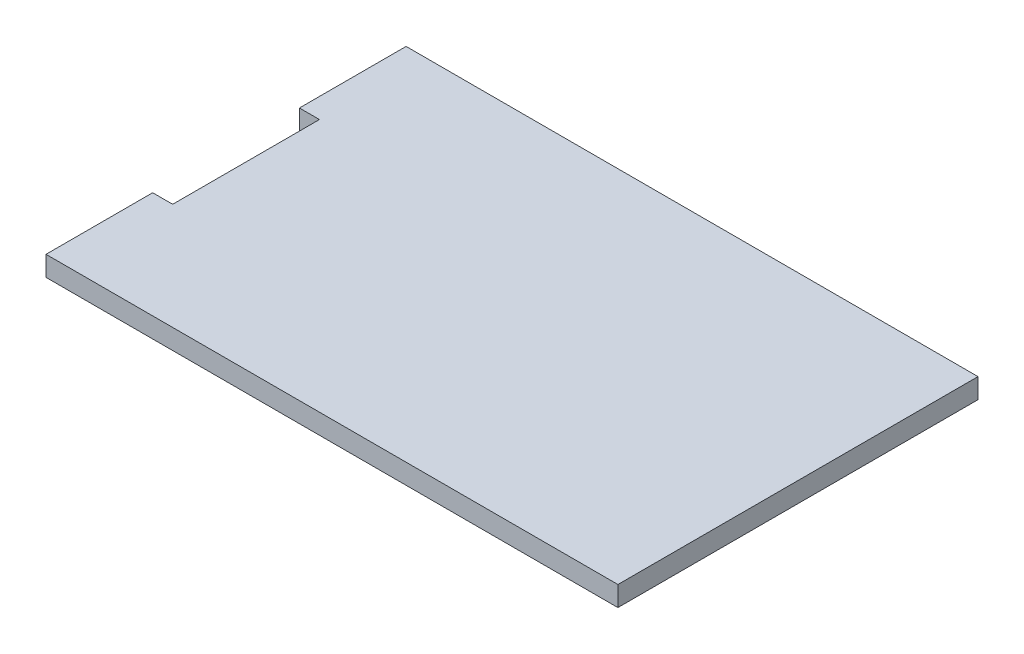
ISO-10303-21;
HEADER;
FILE_DESCRIPTION(('STEP AP214'),'2;1');
FILE_NAME('part.step','',(''),(''),'','','');
FILE_SCHEMA(('AUTOMOTIVE_DESIGN { 1 0 10303 214 1 1 1 1 }'));
ENDSEC;
DATA;
#1=APPLICATION_CONTEXT('core data for automotive mechanical design processes');
#2=APPLICATION_PROTOCOL_DEFINITION('international standard','automotive_design',2000,#1);
#3=PRODUCT_CONTEXT('',#1,'mechanical');
#4=PRODUCT('Part','Part','',(#3));
#5=PRODUCT_RELATED_PRODUCT_CATEGORY('part','',(#4));
#6=PRODUCT_DEFINITION_FORMATION('','',#4);
#7=PRODUCT_DEFINITION_CONTEXT('part definition',#1,'design');
#8=PRODUCT_DEFINITION('design','',#6,#7);
#9=PRODUCT_DEFINITION_SHAPE('','',#8);
#10=(LENGTH_UNIT() NAMED_UNIT(*) SI_UNIT(.MILLI.,.METRE.));
#11=(NAMED_UNIT(*) PLANE_ANGLE_UNIT() SI_UNIT($,.RADIAN.));
#12=(NAMED_UNIT(*) SI_UNIT($,.STERADIAN.) SOLID_ANGLE_UNIT());
#13=UNCERTAINTY_MEASURE_WITH_UNIT(LENGTH_MEASURE(1.E-05),#10,'distance_accuracy_value','');
#14=(GEOMETRIC_REPRESENTATION_CONTEXT(3) GLOBAL_UNCERTAINTY_ASSIGNED_CONTEXT((#13)) GLOBAL_UNIT_ASSIGNED_CONTEXT((#10,
#11,#12)) REPRESENTATION_CONTEXT('',''));
#15=CARTESIAN_POINT('',(0.,0.,0.));
#16=DIRECTION('',(0.,0.,1.));
#17=DIRECTION('',(1.,0.,0.));
#18=AXIS2_PLACEMENT_3D('',#15,#16,#17);
#19=CARTESIAN_POINT('',(42.8625,3.,26.9875));
#20=DIRECTION('',(-1.,0.,0.));
#21=DIRECTION('',(0.,0.,1.));
#22=AXIS2_PLACEMENT_3D('',#19,#20,#21);
#23=PLANE('',#22);
#24=DIRECTION('',(0.,0.,-1.));
#25=VECTOR('',#24,1.);
#26=CARTESIAN_POINT('',(42.8625,0.,26.9875));
#27=LINE('',#26,#25);
#28=CARTESIAN_POINT('',(42.8625,0.,26.9875));
#29=VERTEX_POINT('',#28);
#30=CARTESIAN_POINT('',(42.8625,0.,-26.9875));
#31=VERTEX_POINT('',#30);
#32=EDGE_CURVE('E128',#29,#31,#27,.T.);
#33=ORIENTED_EDGE('',*,*,#32,.T.);
#34=DIRECTION('',(0.,-1.,0.));
#35=VECTOR('',#34,1.);
#36=CARTESIAN_POINT('',(42.8625,3.,-26.9875));
#37=LINE('',#36,#35);
#38=CARTESIAN_POINT('',(42.8625,3.,-26.9875));
#39=VERTEX_POINT('',#38);
#40=EDGE_CURVE('E11',#39,#31,#37,.T.);
#41=ORIENTED_EDGE('',*,*,#40,.F.);
#42=DIRECTION('',(0.,0.,-1.));
#43=VECTOR('',#42,1.);
#44=CARTESIAN_POINT('',(42.8625,3.,26.9875));
#45=LINE('',#44,#43);
#46=CARTESIAN_POINT('',(42.8625,3.,26.9875));
#47=VERTEX_POINT('',#46);
#48=EDGE_CURVE('E142',#47,#39,#45,.T.);
#49=ORIENTED_EDGE('',*,*,#48,.F.);
#50=DIRECTION('',(0.,-1.,0.));
#51=VECTOR('',#50,1.);
#52=CARTESIAN_POINT('',(42.8625,3.,26.9875));
#53=LINE('',#52,#51);
#54=EDGE_CURVE('E124',#47,#29,#53,.T.);
#55=ORIENTED_EDGE('',*,*,#54,.T.);
#56=EDGE_LOOP('',(#33,#41,#49,#55));
#57=FACE_BOUND('',#56,.T.);
#58=ADVANCED_FACE('F32',(#57),#23,.F.);
#59=CARTESIAN_POINT('',(-42.8625,3.,-26.9875));
#60=DIRECTION('',(0.,0.,1.));
#61=DIRECTION('',(1.,0.,0.));
#62=AXIS2_PLACEMENT_3D('',#59,#60,#61);
#63=PLANE('',#62);
#64=DIRECTION('',(-1.,0.,0.));
#65=VECTOR('',#64,1.);
#66=CARTESIAN_POINT('',(-42.8625,0.,-26.9875));
#67=LINE('',#66,#65);
#68=CARTESIAN_POINT('',(-42.8625,0.,-26.9875));
#69=VERTEX_POINT('',#68);
#70=EDGE_CURVE('E131',#31,#69,#67,.T.);
#71=ORIENTED_EDGE('',*,*,#70,.T.);
#72=DIRECTION('',(0.,-1.,0.));
#73=VECTOR('',#72,1.);
#74=CARTESIAN_POINT('',(-42.8625,3.,-26.9875));
#75=LINE('',#74,#73);
#76=CARTESIAN_POINT('',(-42.8625,3.,-26.9875));
#77=VERTEX_POINT('',#76);
#78=EDGE_CURVE('E40',#77,#69,#75,.T.);
#79=ORIENTED_EDGE('',*,*,#78,.F.);
#80=DIRECTION('',(-1.,0.,0.));
#81=VECTOR('',#80,1.);
#82=CARTESIAN_POINT('',(-42.8625,3.,-26.9875));
#83=LINE('',#82,#81);
#84=EDGE_CURVE('E91',#39,#77,#83,.T.);
#85=ORIENTED_EDGE('',*,*,#84,.F.);
#86=ORIENTED_EDGE('',*,*,#40,.T.);
#87=EDGE_LOOP('',(#71,#79,#85,#86));
#88=FACE_BOUND('',#87,.T.);
#89=ADVANCED_FACE('F177',(#88),#63,.F.);
#90=CARTESIAN_POINT('',(-42.8625,3.,-11.));
#91=DIRECTION('',(1.,0.,0.));
#92=DIRECTION('',(0.,0.,-1.));
#93=AXIS2_PLACEMENT_3D('',#90,#91,#92);
#94=PLANE('',#93);
#95=DIRECTION('',(0.,0.,1.));
#96=VECTOR('',#95,1.);
#97=CARTESIAN_POINT('',(-42.8625,0.,-11.));
#98=LINE('',#97,#96);
#99=CARTESIAN_POINT('',(-42.8625,0.,-11.));
#100=VERTEX_POINT('',#99);
#101=EDGE_CURVE('E133',#69,#100,#98,.T.);
#102=ORIENTED_EDGE('',*,*,#101,.T.);
#103=DIRECTION('',(0.,-1.,0.));
#104=VECTOR('',#103,1.);
#105=CARTESIAN_POINT('',(-42.8625,3.,-11.));
#106=LINE('',#105,#104);
#107=CARTESIAN_POINT('',(-42.8625,3.,-11.));
#108=VERTEX_POINT('',#107);
#109=EDGE_CURVE('E149',#108,#100,#106,.T.);
#110=ORIENTED_EDGE('',*,*,#109,.F.);
#111=DIRECTION('',(0.,0.,1.));
#112=VECTOR('',#111,1.);
#113=CARTESIAN_POINT('',(-42.8625,3.,-11.));
#114=LINE('',#113,#112);
#115=EDGE_CURVE('E157',#77,#108,#114,.T.);
#116=ORIENTED_EDGE('',*,*,#115,.F.);
#117=ORIENTED_EDGE('',*,*,#78,.T.);
#118=EDGE_LOOP('',(#102,#110,#116,#117));
#119=FACE_BOUND('',#118,.T.);
#120=ADVANCED_FACE('F155',(#119),#94,.F.);
#121=CARTESIAN_POINT('',(-42.8625,3.,-11.));
#122=DIRECTION('',(0.,0.,-1.));
#123=DIRECTION('',(-1.,0.,0.));
#124=AXIS2_PLACEMENT_3D('',#121,#122,#123);
#125=PLANE('',#124);
#126=DIRECTION('',(1.,0.,0.));
#127=VECTOR('',#126,1.);
#128=CARTESIAN_POINT('',(-42.8625,0.,-11.));
#129=LINE('',#128,#127);
#130=CARTESIAN_POINT('',(-39.8625,0.,-11.));
#131=VERTEX_POINT('',#130);
#132=EDGE_CURVE('E135',#100,#131,#129,.T.);
#133=ORIENTED_EDGE('',*,*,#132,.T.);
#134=DIRECTION('',(0.,-1.,0.));
#135=VECTOR('',#134,1.);
#136=CARTESIAN_POINT('',(-39.8625,3.,-11.));
#137=LINE('',#136,#135);
#138=CARTESIAN_POINT('',(-39.8625,3.,-11.));
#139=VERTEX_POINT('',#138);
#140=EDGE_CURVE('E146',#139,#131,#137,.T.);
#141=ORIENTED_EDGE('',*,*,#140,.F.);
#142=DIRECTION('',(1.,0.,0.));
#143=VECTOR('',#142,1.);
#144=CARTESIAN_POINT('',(-42.8625,3.,-11.));
#145=LINE('',#144,#143);
#146=EDGE_CURVE('E169',#108,#139,#145,.T.);
#147=ORIENTED_EDGE('',*,*,#146,.F.);
#148=ORIENTED_EDGE('',*,*,#109,.T.);
#149=EDGE_LOOP('',(#133,#141,#147,#148));
#150=FACE_BOUND('',#149,.T.);
#151=ADVANCED_FACE('F165',(#150),#125,.F.);
#152=CARTESIAN_POINT('',(-39.8625,3.,-11.));
#153=DIRECTION('',(1.,0.,0.));
#154=DIRECTION('',(0.,0.,-1.));
#155=AXIS2_PLACEMENT_3D('',#152,#153,#154);
#156=PLANE('',#155);
#157=DIRECTION('',(0.,0.,1.));
#158=VECTOR('',#157,1.);
#159=CARTESIAN_POINT('',(-39.8625,0.,-11.));
#160=LINE('',#159,#158);
#161=CARTESIAN_POINT('',(-39.8625,0.,11.));
#162=VERTEX_POINT('',#161);
#163=EDGE_CURVE('E137',#131,#162,#160,.T.);
#164=ORIENTED_EDGE('',*,*,#163,.T.);
#165=DIRECTION('',(0.,-1.,0.));
#166=VECTOR('',#165,1.);
#167=CARTESIAN_POINT('',(-39.8625,3.,11.));
#168=LINE('',#167,#166);
#169=CARTESIAN_POINT('',(-39.8625,3.,11.));
#170=VERTEX_POINT('',#169);
#171=EDGE_CURVE('E119',#170,#162,#168,.T.);
#172=ORIENTED_EDGE('',*,*,#171,.F.);
#173=DIRECTION('',(0.,0.,1.));
#174=VECTOR('',#173,1.);
#175=CARTESIAN_POINT('',(-39.8625,3.,-11.));
#176=LINE('',#175,#174);
#177=EDGE_CURVE('E110',#139,#170,#176,.T.);
#178=ORIENTED_EDGE('',*,*,#177,.F.);
#179=ORIENTED_EDGE('',*,*,#140,.T.);
#180=EDGE_LOOP('',(#164,#172,#178,#179));
#181=FACE_BOUND('',#180,.T.);
#182=ADVANCED_FACE('F168',(#181),#156,.F.);
#183=CARTESIAN_POINT('',(-39.8625,3.,11.));
#184=DIRECTION('',(0.,0.,1.));
#185=DIRECTION('',(1.,0.,0.));
#186=AXIS2_PLACEMENT_3D('',#183,#184,#185);
#187=PLANE('',#186);
#188=DIRECTION('',(-1.,0.,0.));
#189=VECTOR('',#188,1.);
#190=CARTESIAN_POINT('',(-39.8625,0.,11.));
#191=LINE('',#190,#189);
#192=CARTESIAN_POINT('',(-42.8625,0.,11.));
#193=VERTEX_POINT('',#192);
#194=EDGE_CURVE('E118',#162,#193,#191,.T.);
#195=ORIENTED_EDGE('',*,*,#194,.T.);
#196=DIRECTION('',(0.,-1.,0.));
#197=VECTOR('',#196,1.);
#198=CARTESIAN_POINT('',(-42.8625,3.,11.));
#199=LINE('',#198,#197);
#200=CARTESIAN_POINT('',(-42.8625,3.,11.));
#201=VERTEX_POINT('',#200);
#202=EDGE_CURVE('E115',#201,#193,#199,.T.);
#203=ORIENTED_EDGE('',*,*,#202,.F.);
#204=DIRECTION('',(-1.,0.,0.));
#205=VECTOR('',#204,1.);
#206=CARTESIAN_POINT('',(-39.8625,3.,11.));
#207=LINE('',#206,#205);
#208=EDGE_CURVE('E104',#170,#201,#207,.T.);
#209=ORIENTED_EDGE('',*,*,#208,.F.);
#210=ORIENTED_EDGE('',*,*,#171,.T.);
#211=EDGE_LOOP('',(#195,#203,#209,#210));
#212=FACE_BOUND('',#211,.T.);
#213=ADVANCED_FACE('F116',(#212),#187,.F.);
#214=CARTESIAN_POINT('',(-42.8625,3.,26.9875));
#215=DIRECTION('',(1.,0.,0.));
#216=DIRECTION('',(0.,0.,-1.));
#217=AXIS2_PLACEMENT_3D('',#214,#215,#216);
#218=PLANE('',#217);
#219=DIRECTION('',(0.,0.,1.));
#220=VECTOR('',#219,1.);
#221=CARTESIAN_POINT('',(-42.8625,0.,26.9875));
#222=LINE('',#221,#220);
#223=CARTESIAN_POINT('',(-42.8625,0.,26.9875));
#224=VERTEX_POINT('',#223);
#225=EDGE_CURVE('E77',#193,#224,#222,.T.);
#226=ORIENTED_EDGE('',*,*,#225,.T.);
#227=DIRECTION('',(0.,-1.,0.));
#228=VECTOR('',#227,1.);
#229=CARTESIAN_POINT('',(-42.8625,3.,26.9875));
#230=LINE('',#229,#228);
#231=CARTESIAN_POINT('',(-42.8625,3.,26.9875));
#232=VERTEX_POINT('',#231);
#233=EDGE_CURVE('E120',#232,#224,#230,.T.);
#234=ORIENTED_EDGE('',*,*,#233,.F.);
#235=DIRECTION('',(0.,0.,1.));
#236=VECTOR('',#235,1.);
#237=CARTESIAN_POINT('',(-42.8625,3.,26.9875));
#238=LINE('',#237,#236);
#239=EDGE_CURVE('E108',#201,#232,#238,.T.);
#240=ORIENTED_EDGE('',*,*,#239,.F.);
#241=ORIENTED_EDGE('',*,*,#202,.T.);
#242=EDGE_LOOP('',(#226,#234,#240,#241));
#243=FACE_BOUND('',#242,.T.);
#244=ADVANCED_FACE('F122',(#243),#218,.F.);
#245=CARTESIAN_POINT('',(-42.8625,3.,26.9875));
#246=DIRECTION('',(0.,0.,-1.));
#247=DIRECTION('',(-1.,0.,0.));
#248=AXIS2_PLACEMENT_3D('',#245,#246,#247);
#249=PLANE('',#248);
#250=DIRECTION('',(1.,0.,0.));
#251=VECTOR('',#250,1.);
#252=CARTESIAN_POINT('',(-42.8625,0.,26.9875));
#253=LINE('',#252,#251);
#254=EDGE_CURVE('E83',#224,#29,#253,.T.);
#255=ORIENTED_EDGE('',*,*,#254,.T.);
#256=ORIENTED_EDGE('',*,*,#54,.F.);
#257=DIRECTION('',(1.,0.,0.));
#258=VECTOR('',#257,1.);
#259=CARTESIAN_POINT('',(-42.8625,3.,26.9875));
#260=LINE('',#259,#258);
#261=EDGE_CURVE('E48',#232,#47,#260,.T.);
#262=ORIENTED_EDGE('',*,*,#261,.F.);
#263=ORIENTED_EDGE('',*,*,#233,.T.);
#264=EDGE_LOOP('',(#255,#256,#262,#263));
#265=FACE_BOUND('',#264,.T.);
#266=ADVANCED_FACE('F193',(#265),#249,.F.);
#267=CARTESIAN_POINT('',(0.,3.,0.));
#268=DIRECTION('',(0.,-1.,0.));
#269=DIRECTION('',(0.,0.,-1.));
#270=AXIS2_PLACEMENT_3D('',#267,#268,#269);
#271=PLANE('',#270);
#272=ORIENTED_EDGE('',*,*,#48,.T.);
#273=ORIENTED_EDGE('',*,*,#84,.T.);
#274=ORIENTED_EDGE('',*,*,#115,.T.);
#275=ORIENTED_EDGE('',*,*,#146,.T.);
#276=ORIENTED_EDGE('',*,*,#177,.T.);
#277=ORIENTED_EDGE('',*,*,#208,.T.);
#278=ORIENTED_EDGE('',*,*,#239,.T.);
#279=ORIENTED_EDGE('',*,*,#261,.T.);
#280=EDGE_LOOP('',(#272,#273,#274,#275,#276,#277,#278,#279));
#281=FACE_BOUND('',#280,.T.);
#282=ADVANCED_FACE('F106',(#281),#271,.F.);
#283=CARTESIAN_POINT('',(0.,0.,0.));
#284=DIRECTION('',(0.,-1.,0.));
#285=DIRECTION('',(0.,0.,-1.));
#286=AXIS2_PLACEMENT_3D('',#283,#284,#285);
#287=PLANE('',#286);
#288=ORIENTED_EDGE('',*,*,#32,.F.);
#289=ORIENTED_EDGE('',*,*,#254,.F.);
#290=ORIENTED_EDGE('',*,*,#225,.F.);
#291=ORIENTED_EDGE('',*,*,#194,.F.);
#292=ORIENTED_EDGE('',*,*,#163,.F.);
#293=ORIENTED_EDGE('',*,*,#132,.F.);
#294=ORIENTED_EDGE('',*,*,#101,.F.);
#295=ORIENTED_EDGE('',*,*,#70,.F.);
#296=EDGE_LOOP('',(#288,#289,#290,#291,#292,#293,#294,#295));
#297=FACE_BOUND('',#296,.T.);
#298=ADVANCED_FACE('F161',(#297),#287,.T.);
#299=CLOSED_SHELL('',(#58,#89,#120,#151,#182,#213,#244,#266,#282,#298));
#300=MANIFOLD_SOLID_BREP('B2',#299);
#301=ADVANCED_BREP_SHAPE_REPRESENTATION('',(#18,#300),#14);
#302=SHAPE_DEFINITION_REPRESENTATION(#9,#301);
ENDSEC;
END-ISO-10303-21;
